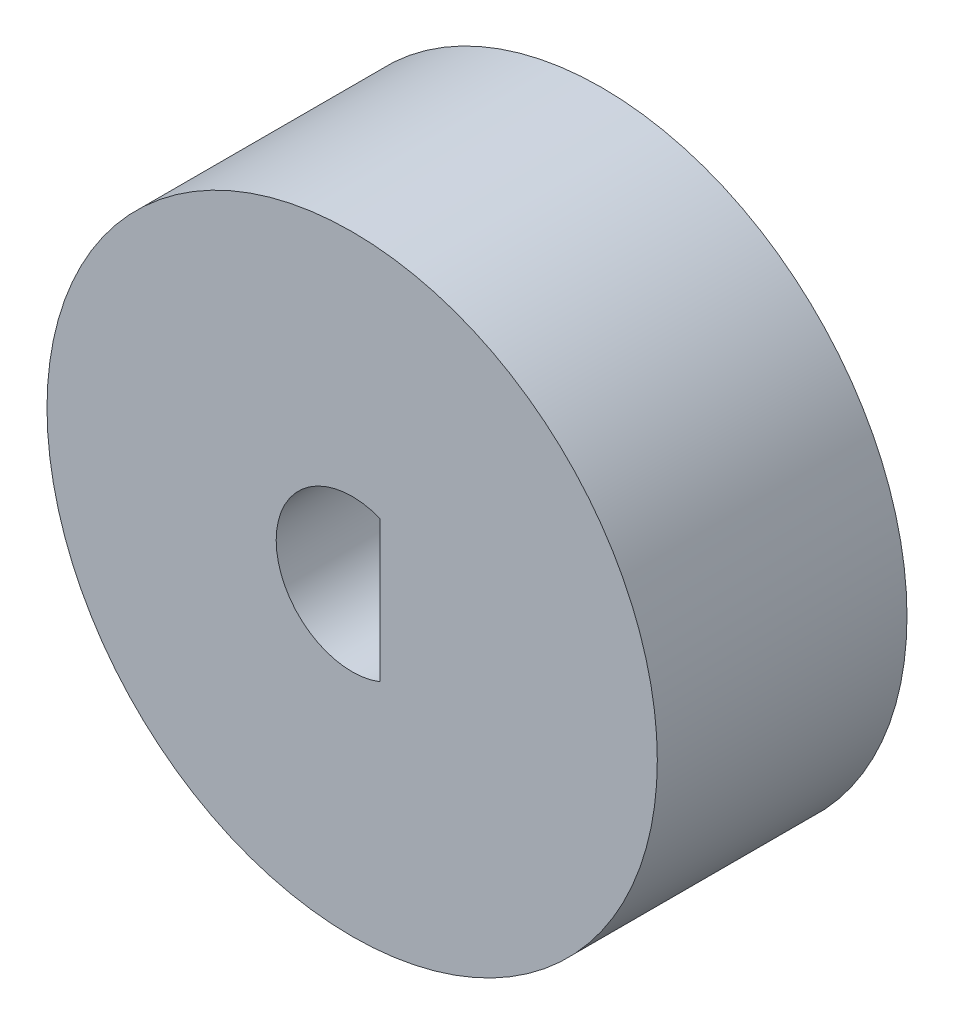
ISO-10303-21;
HEADER;
FILE_DESCRIPTION(('STEP AP214'),'2;1');
FILE_NAME('part.step','',(''),(''),'','','');
FILE_SCHEMA(('AUTOMOTIVE_DESIGN { 1 0 10303 214 1 1 1 1 }'));
ENDSEC;
DATA;
#1=APPLICATION_CONTEXT('core data for automotive mechanical design processes');
#2=APPLICATION_PROTOCOL_DEFINITION('international standard','automotive_design',2000,#1);
#3=PRODUCT_CONTEXT('',#1,'mechanical');
#4=PRODUCT('Part','Part','',(#3));
#5=PRODUCT_RELATED_PRODUCT_CATEGORY('part','',(#4));
#6=PRODUCT_DEFINITION_FORMATION('','',#4);
#7=PRODUCT_DEFINITION_CONTEXT('part definition',#1,'design');
#8=PRODUCT_DEFINITION('design','',#6,#7);
#9=PRODUCT_DEFINITION_SHAPE('','',#8);
#10=(LENGTH_UNIT() NAMED_UNIT(*) SI_UNIT(.MILLI.,.METRE.));
#11=(NAMED_UNIT(*) PLANE_ANGLE_UNIT() SI_UNIT($,.RADIAN.));
#12=(NAMED_UNIT(*) SI_UNIT($,.STERADIAN.) SOLID_ANGLE_UNIT());
#13=UNCERTAINTY_MEASURE_WITH_UNIT(LENGTH_MEASURE(1.E-05),#10,'distance_accuracy_value','');
#14=(GEOMETRIC_REPRESENTATION_CONTEXT(3) GLOBAL_UNCERTAINTY_ASSIGNED_CONTEXT((#13)) GLOBAL_UNIT_ASSIGNED_CONTEXT((#10,
#11,#12)) REPRESENTATION_CONTEXT('',''));
#15=CARTESIAN_POINT('',(0.,0.,0.));
#16=DIRECTION('',(0.,0.,1.));
#17=DIRECTION('',(1.,0.,0.));
#18=AXIS2_PLACEMENT_3D('',#15,#16,#17);
#19=CARTESIAN_POINT('',(0.,0.,18.));
#20=DIRECTION('',(0.,0.,1.));
#21=DIRECTION('',(1.,0.,0.));
#22=AXIS2_PLACEMENT_3D('',#19,#20,#21);
#23=PLANE('',#22);
#24=CARTESIAN_POINT('',(0.,0.,18.));
#25=DIRECTION('',(0.,0.,1.));
#26=DIRECTION('',(1.,0.,0.));
#27=AXIS2_PLACEMENT_3D('',#24,#25,#26);
#28=CIRCLE('',#27,22.);
#29=CARTESIAN_POINT('',(22.,0.,18.));
#30=VERTEX_POINT('',#29);
#31=EDGE_CURVE('E11',#30,#30,#28,.T.);
#32=ORIENTED_EDGE('',*,*,#31,.T.);
#33=EDGE_LOOP('',(#32));
#34=FACE_BOUND('',#33,.T.);
#35=DIRECTION('',(0.,1.,0.));
#36=VECTOR('',#35,1.);
#37=CARTESIAN_POINT('',(2.,-5.1,18.));
#38=LINE('',#37,#36);
#39=CARTESIAN_POINT('',(2.,-5.1,18.));
#40=VERTEX_POINT('',#39);
#41=CARTESIAN_POINT('',(2.,5.1,18.));
#42=VERTEX_POINT('',#41);
#43=EDGE_CURVE('E82',#40,#42,#38,.T.);
#44=ORIENTED_EDGE('',*,*,#43,.F.);
#45=CARTESIAN_POINT('',(0.,0.,18.));
#46=DIRECTION('',(0.,0.,1.));
#47=DIRECTION('',(1.,0.,0.));
#48=AXIS2_PLACEMENT_3D('',#45,#46,#47);
#49=CIRCLE('',#48,5.47813836992094);
#50=EDGE_CURVE('E73',#42,#40,#49,.T.);
#51=ORIENTED_EDGE('',*,*,#50,.F.);
#52=EDGE_LOOP('',(#44,#51));
#53=FACE_BOUND('',#52,.T.);
#54=ADVANCED_FACE('F41',(#34,#53),#23,.T.);
#55=CARTESIAN_POINT('',(0.,0.,0.));
#56=DIRECTION('',(0.,0.,1.));
#57=DIRECTION('',(1.,0.,0.));
#58=AXIS2_PLACEMENT_3D('',#55,#56,#57);
#59=PLANE('',#58);
#60=CARTESIAN_POINT('',(0.,0.,0.));
#61=DIRECTION('',(0.,0.,1.));
#62=DIRECTION('',(1.,0.,0.));
#63=AXIS2_PLACEMENT_3D('',#60,#61,#62);
#64=CIRCLE('',#63,22.);
#65=CARTESIAN_POINT('',(22.,0.,0.));
#66=VERTEX_POINT('',#65);
#67=EDGE_CURVE('E45',#66,#66,#64,.T.);
#68=ORIENTED_EDGE('',*,*,#67,.F.);
#69=EDGE_LOOP('',(#68));
#70=FACE_BOUND('',#69,.T.);
#71=CARTESIAN_POINT('',(0.,0.,0.));
#72=DIRECTION('',(0.,0.,1.));
#73=DIRECTION('',(1.,0.,0.));
#74=AXIS2_PLACEMENT_3D('',#71,#72,#73);
#75=CIRCLE('',#74,5.47813836992094);
#76=CARTESIAN_POINT('',(2.,5.1,0.));
#77=VERTEX_POINT('',#76);
#78=CARTESIAN_POINT('',(2.,-5.1,0.));
#79=VERTEX_POINT('',#78);
#80=EDGE_CURVE('E63',#77,#79,#75,.T.);
#81=ORIENTED_EDGE('',*,*,#80,.T.);
#82=DIRECTION('',(0.,1.,0.));
#83=VECTOR('',#82,1.);
#84=CARTESIAN_POINT('',(2.,-5.1,0.));
#85=LINE('',#84,#83);
#86=EDGE_CURVE('E69',#79,#77,#85,.T.);
#87=ORIENTED_EDGE('',*,*,#86,.T.);
#88=EDGE_LOOP('',(#81,#87));
#89=FACE_BOUND('',#88,.T.);
#90=ADVANCED_FACE('F79',(#70,#89),#59,.F.);
#91=CARTESIAN_POINT('',(0.,0.,18.));
#92=DIRECTION('',(0.,0.,-1.));
#93=DIRECTION('',(-1.,0.,0.));
#94=AXIS2_PLACEMENT_3D('',#91,#92,#93);
#95=CYLINDRICAL_SURFACE('',#94,22.);
#96=ORIENTED_EDGE('',*,*,#31,.F.);
#97=EDGE_LOOP('',(#96));
#98=FACE_BOUND('',#97,.T.);
#99=ORIENTED_EDGE('',*,*,#67,.T.);
#100=EDGE_LOOP('',(#99));
#101=FACE_BOUND('',#100,.T.);
#102=ADVANCED_FACE('F43',(#98,#101),#95,.T.);
#103=CARTESIAN_POINT('',(0.,0.,18.));
#104=DIRECTION('',(0.,0.,-1.));
#105=DIRECTION('',(-1.,0.,0.));
#106=AXIS2_PLACEMENT_3D('',#103,#104,#105);
#107=CYLINDRICAL_SURFACE('',#106,5.47813836992094);
#108=ORIENTED_EDGE('',*,*,#80,.F.);
#109=DIRECTION('',(0.,0.,-1.));
#110=VECTOR('',#109,1.);
#111=CARTESIAN_POINT('',(2.,5.1,18.));
#112=LINE('',#111,#110);
#113=EDGE_CURVE('E71',#42,#77,#112,.T.);
#114=ORIENTED_EDGE('',*,*,#113,.F.);
#115=ORIENTED_EDGE('',*,*,#50,.T.);
#116=DIRECTION('',(0.,0.,-1.));
#117=VECTOR('',#116,1.);
#118=CARTESIAN_POINT('',(2.,-5.1,18.));
#119=LINE('',#118,#117);
#120=EDGE_CURVE('E56',#40,#79,#119,.T.);
#121=ORIENTED_EDGE('',*,*,#120,.T.);
#122=EDGE_LOOP('',(#108,#114,#115,#121));
#123=FACE_BOUND('',#122,.T.);
#124=ADVANCED_FACE('F75',(#123),#107,.F.);
#125=CARTESIAN_POINT('',(2.,-5.1,18.));
#126=DIRECTION('',(-1.,0.,0.));
#127=DIRECTION('',(0.,0.,1.));
#128=AXIS2_PLACEMENT_3D('',#125,#126,#127);
#129=PLANE('',#128);
#130=ORIENTED_EDGE('',*,*,#86,.F.);
#131=ORIENTED_EDGE('',*,*,#120,.F.);
#132=ORIENTED_EDGE('',*,*,#43,.T.);
#133=ORIENTED_EDGE('',*,*,#113,.T.);
#134=EDGE_LOOP('',(#130,#131,#132,#133));
#135=FACE_BOUND('',#134,.T.);
#136=ADVANCED_FACE('F70',(#135),#129,.T.);
#137=CLOSED_SHELL('',(#54,#90,#102,#124,#136));
#138=MANIFOLD_SOLID_BREP('B2',#137);
#139=ADVANCED_BREP_SHAPE_REPRESENTATION('',(#18,#138),#14);
#140=SHAPE_DEFINITION_REPRESENTATION(#9,#139);
ENDSEC;
END-ISO-10303-21;
